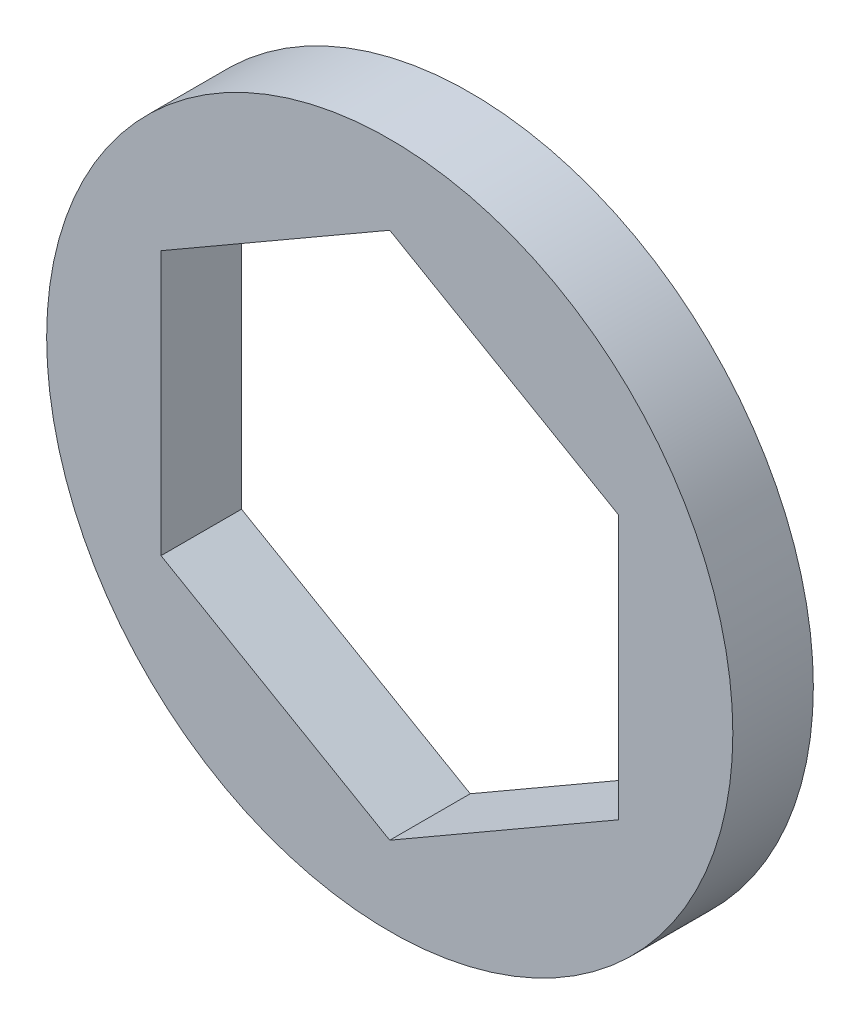
ISO-10303-21;
HEADER;
FILE_DESCRIPTION(('STEP AP214'),'2;1');
FILE_NAME('part.step','',(''),(''),'','','');
FILE_SCHEMA(('AUTOMOTIVE_DESIGN { 1 0 10303 214 1 1 1 1 }'));
ENDSEC;
DATA;
#1=APPLICATION_CONTEXT('core data for automotive mechanical design processes');
#2=APPLICATION_PROTOCOL_DEFINITION('international standard','automotive_design',2000,#1);
#3=PRODUCT_CONTEXT('',#1,'mechanical');
#4=PRODUCT('Part','Part','',(#3));
#5=PRODUCT_RELATED_PRODUCT_CATEGORY('part','',(#4));
#6=PRODUCT_DEFINITION_FORMATION('','',#4);
#7=PRODUCT_DEFINITION_CONTEXT('part definition',#1,'design');
#8=PRODUCT_DEFINITION('design','',#6,#7);
#9=PRODUCT_DEFINITION_SHAPE('','',#8);
#10=(LENGTH_UNIT() NAMED_UNIT(*) SI_UNIT(.MILLI.,.METRE.));
#11=(NAMED_UNIT(*) PLANE_ANGLE_UNIT() SI_UNIT($,.RADIAN.));
#12=(NAMED_UNIT(*) SI_UNIT($,.STERADIAN.) SOLID_ANGLE_UNIT());
#13=UNCERTAINTY_MEASURE_WITH_UNIT(LENGTH_MEASURE(1.E-05),#10,'distance_accuracy_value','');
#14=(GEOMETRIC_REPRESENTATION_CONTEXT(3) GLOBAL_UNCERTAINTY_ASSIGNED_CONTEXT((#13)) GLOBAL_UNIT_ASSIGNED_CONTEXT((#10,
#11,#12)) REPRESENTATION_CONTEXT('',''));
#15=CARTESIAN_POINT('',(0.,0.,0.));
#16=DIRECTION('',(0.,0.,1.));
#17=DIRECTION('',(1.,0.,0.));
#18=AXIS2_PLACEMENT_3D('',#15,#16,#17);
#19=CARTESIAN_POINT('',(0.,0.,2.2352));
#20=DIRECTION('',(0.,0.,1.));
#21=DIRECTION('',(1.,0.,0.));
#22=AXIS2_PLACEMENT_3D('',#19,#20,#21);
#23=PLANE('',#22);
#24=CARTESIAN_POINT('',(0.,0.,2.2352));
#25=DIRECTION('',(0.,0.,1.));
#26=DIRECTION('',(1.,0.,0.));
#27=AXIS2_PLACEMENT_3D('',#24,#25,#26);
#28=CIRCLE('',#27,9.525);
#29=CARTESIAN_POINT('',(9.525,0.,2.2352));
#30=VERTEX_POINT('',#29);
#31=EDGE_CURVE('E11',#30,#30,#28,.T.);
#32=ORIENTED_EDGE('',*,*,#31,.T.);
#33=EDGE_LOOP('',(#32));
#34=FACE_BOUND('',#33,.T.);
#35=DIRECTION('',(-0.866025403784439,-0.5,0.));
#36=VECTOR('',#35,1.);
#37=CARTESIAN_POINT('',(0.,7.33234841870825,2.2352));
#38=LINE('',#37,#36);
#39=CARTESIAN_POINT('',(0.,7.33234841870825,2.2352));
#40=VERTEX_POINT('',#39);
#41=CARTESIAN_POINT('',(-6.35,3.66617420935413,2.2352));
#42=VERTEX_POINT('',#41);
#43=EDGE_CURVE('E98',#40,#42,#38,.T.);
#44=ORIENTED_EDGE('',*,*,#43,.F.);
#45=DIRECTION('',(-0.866025403784439,0.5,0.));
#46=VECTOR('',#45,1.);
#47=CARTESIAN_POINT('',(6.35,3.66617420935412,2.2352));
#48=LINE('',#47,#46);
#49=CARTESIAN_POINT('',(6.35,3.66617420935412,2.2352));
#50=VERTEX_POINT('',#49);
#51=EDGE_CURVE('E90',#50,#40,#48,.T.);
#52=ORIENTED_EDGE('',*,*,#51,.F.);
#53=DIRECTION('',(0.,1.,0.));
#54=VECTOR('',#53,1.);
#55=CARTESIAN_POINT('',(6.35,-3.66617420935412,2.2352));
#56=LINE('',#55,#54);
#57=CARTESIAN_POINT('',(6.35,-3.66617420935412,2.2352));
#58=VERTEX_POINT('',#57);
#59=EDGE_CURVE('E118',#58,#50,#56,.T.);
#60=ORIENTED_EDGE('',*,*,#59,.F.);
#61=DIRECTION('',(0.866025403784439,0.5,0.));
#62=VECTOR('',#61,1.);
#63=CARTESIAN_POINT('',(0.,-7.33234841870825,2.2352));
#64=LINE('',#63,#62);
#65=CARTESIAN_POINT('',(0.,-7.33234841870825,2.2352));
#66=VERTEX_POINT('',#65);
#67=EDGE_CURVE('E116',#66,#58,#64,.T.);
#68=ORIENTED_EDGE('',*,*,#67,.F.);
#69=DIRECTION('',(0.866025403784439,-0.5,0.));
#70=VECTOR('',#69,1.);
#71=CARTESIAN_POINT('',(-6.35,-3.66617420935412,2.2352));
#72=LINE('',#71,#70);
#73=CARTESIAN_POINT('',(-6.35,-3.66617420935412,2.2352));
#74=VERTEX_POINT('',#73);
#75=EDGE_CURVE('E112',#74,#66,#72,.T.);
#76=ORIENTED_EDGE('',*,*,#75,.F.);
#77=DIRECTION('',(0.,-1.,0.));
#78=VECTOR('',#77,1.);
#79=CARTESIAN_POINT('',(-6.35,3.66617420935413,2.2352));
#80=LINE('',#79,#78);
#81=EDGE_CURVE('E110',#42,#74,#80,.T.);
#82=ORIENTED_EDGE('',*,*,#81,.F.);
#83=EDGE_LOOP('',(#44,#52,#60,#68,#76,#82));
#84=FACE_BOUND('',#83,.T.);
#85=ADVANCED_FACE('F37',(#34,#84),#23,.T.);
#86=CARTESIAN_POINT('',(0.,0.,0.));
#87=DIRECTION('',(0.,0.,1.));
#88=DIRECTION('',(1.,0.,0.));
#89=AXIS2_PLACEMENT_3D('',#86,#87,#88);
#90=PLANE('',#89);
#91=CARTESIAN_POINT('',(0.,0.,0.));
#92=DIRECTION('',(0.,0.,1.));
#93=DIRECTION('',(1.,0.,0.));
#94=AXIS2_PLACEMENT_3D('',#91,#92,#93);
#95=CIRCLE('',#94,9.525);
#96=CARTESIAN_POINT('',(9.525,0.,0.));
#97=VERTEX_POINT('',#96);
#98=EDGE_CURVE('E41',#97,#97,#95,.T.);
#99=ORIENTED_EDGE('',*,*,#98,.F.);
#100=EDGE_LOOP('',(#99));
#101=FACE_BOUND('',#100,.T.);
#102=DIRECTION('',(-0.866025403784439,0.5,0.));
#103=VECTOR('',#102,1.);
#104=CARTESIAN_POINT('',(6.35,3.66617420935412,0.));
#105=LINE('',#104,#103);
#106=CARTESIAN_POINT('',(6.35,3.66617420935412,0.));
#107=VERTEX_POINT('',#106);
#108=CARTESIAN_POINT('',(0.,7.33234841870825,0.));
#109=VERTEX_POINT('',#108);
#110=EDGE_CURVE('E60',#107,#109,#105,.T.);
#111=ORIENTED_EDGE('',*,*,#110,.T.);
#112=DIRECTION('',(-0.866025403784439,-0.5,0.));
#113=VECTOR('',#112,1.);
#114=CARTESIAN_POINT('',(0.,7.33234841870825,0.));
#115=LINE('',#114,#113);
#116=CARTESIAN_POINT('',(-6.35,3.66617420935413,0.));
#117=VERTEX_POINT('',#116);
#118=EDGE_CURVE('E105',#109,#117,#115,.T.);
#119=ORIENTED_EDGE('',*,*,#118,.T.);
#120=DIRECTION('',(0.,-1.,0.));
#121=VECTOR('',#120,1.);
#122=CARTESIAN_POINT('',(-6.35,3.66617420935413,0.));
#123=LINE('',#122,#121);
#124=CARTESIAN_POINT('',(-6.35,-3.66617420935412,0.));
#125=VERTEX_POINT('',#124);
#126=EDGE_CURVE('E122',#117,#125,#123,.T.);
#127=ORIENTED_EDGE('',*,*,#126,.T.);
#128=DIRECTION('',(0.866025403784439,-0.5,0.));
#129=VECTOR('',#128,1.);
#130=CARTESIAN_POINT('',(-6.35,-3.66617420935412,0.));
#131=LINE('',#130,#129);
#132=CARTESIAN_POINT('',(0.,-7.33234841870825,0.));
#133=VERTEX_POINT('',#132);
#134=EDGE_CURVE('E125',#125,#133,#131,.T.);
#135=ORIENTED_EDGE('',*,*,#134,.T.);
#136=DIRECTION('',(0.866025403784439,0.5,0.));
#137=VECTOR('',#136,1.);
#138=CARTESIAN_POINT('',(0.,-7.33234841870825,0.));
#139=LINE('',#138,#137);
#140=CARTESIAN_POINT('',(6.35,-3.66617420935412,0.));
#141=VERTEX_POINT('',#140);
#142=EDGE_CURVE('E128',#133,#141,#139,.T.);
#143=ORIENTED_EDGE('',*,*,#142,.T.);
#144=DIRECTION('',(0.,1.,0.));
#145=VECTOR('',#144,1.);
#146=CARTESIAN_POINT('',(6.35,-3.66617420935412,0.));
#147=LINE('',#146,#145);
#148=EDGE_CURVE('E99',#141,#107,#147,.T.);
#149=ORIENTED_EDGE('',*,*,#148,.T.);
#150=EDGE_LOOP('',(#111,#119,#127,#135,#143,#149));
#151=FACE_BOUND('',#150,.T.);
#152=ADVANCED_FACE('F145',(#101,#151),#90,.F.);
#153=CARTESIAN_POINT('',(0.,0.,2.2352));
#154=DIRECTION('',(0.,0.,-1.));
#155=DIRECTION('',(-1.,0.,0.));
#156=AXIS2_PLACEMENT_3D('',#153,#154,#155);
#157=CYLINDRICAL_SURFACE('',#156,9.525);
#158=ORIENTED_EDGE('',*,*,#31,.F.);
#159=EDGE_LOOP('',(#158));
#160=FACE_BOUND('',#159,.T.);
#161=ORIENTED_EDGE('',*,*,#98,.T.);
#162=EDGE_LOOP('',(#161));
#163=FACE_BOUND('',#162,.T.);
#164=ADVANCED_FACE('F39',(#160,#163),#157,.T.);
#165=CARTESIAN_POINT('',(6.35,3.66617420935412,2.2352));
#166=DIRECTION('',(-0.5,-0.866025403784439,0.));
#167=DIRECTION('',(0.866025403784439,-0.5,0.));
#168=AXIS2_PLACEMENT_3D('',#165,#166,#167);
#169=PLANE('',#168);
#170=ORIENTED_EDGE('',*,*,#110,.F.);
#171=DIRECTION('',(0.,0.,-1.));
#172=VECTOR('',#171,1.);
#173=CARTESIAN_POINT('',(6.35,3.66617420935412,2.2352));
#174=LINE('',#173,#172);
#175=EDGE_CURVE('E94',#50,#107,#174,.T.);
#176=ORIENTED_EDGE('',*,*,#175,.F.);
#177=ORIENTED_EDGE('',*,*,#51,.T.);
#178=DIRECTION('',(0.,0.,-1.));
#179=VECTOR('',#178,1.);
#180=CARTESIAN_POINT('',(0.,7.33234841870825,2.2352));
#181=LINE('',#180,#179);
#182=EDGE_CURVE('E93',#40,#109,#181,.T.);
#183=ORIENTED_EDGE('',*,*,#182,.T.);
#184=EDGE_LOOP('',(#170,#176,#177,#183));
#185=FACE_BOUND('',#184,.T.);
#186=ADVANCED_FACE('F92',(#185),#169,.T.);
#187=CARTESIAN_POINT('',(0.,7.33234841870825,2.2352));
#188=DIRECTION('',(0.5,-0.866025403784439,0.));
#189=DIRECTION('',(0.866025403784439,0.5,0.));
#190=AXIS2_PLACEMENT_3D('',#187,#188,#189);
#191=PLANE('',#190);
#192=ORIENTED_EDGE('',*,*,#118,.F.);
#193=ORIENTED_EDGE('',*,*,#182,.F.);
#194=ORIENTED_EDGE('',*,*,#43,.T.);
#195=DIRECTION('',(0.,0.,-1.));
#196=VECTOR('',#195,1.);
#197=CARTESIAN_POINT('',(-6.35,3.66617420935413,2.2352));
#198=LINE('',#197,#196);
#199=EDGE_CURVE('E106',#42,#117,#198,.T.);
#200=ORIENTED_EDGE('',*,*,#199,.T.);
#201=EDGE_LOOP('',(#192,#193,#194,#200));
#202=FACE_BOUND('',#201,.T.);
#203=ADVANCED_FACE('F102',(#202),#191,.T.);
#204=CARTESIAN_POINT('',(-6.35,3.66617420935413,2.2352));
#205=DIRECTION('',(1.,0.,0.));
#206=DIRECTION('',(0.,1.,0.));
#207=AXIS2_PLACEMENT_3D('',#204,#205,#206);
#208=PLANE('',#207);
#209=ORIENTED_EDGE('',*,*,#126,.F.);
#210=ORIENTED_EDGE('',*,*,#199,.F.);
#211=ORIENTED_EDGE('',*,*,#81,.T.);
#212=DIRECTION('',(0.,0.,-1.));
#213=VECTOR('',#212,1.);
#214=CARTESIAN_POINT('',(-6.35,-3.66617420935412,2.2352));
#215=LINE('',#214,#213);
#216=EDGE_CURVE('E137',#74,#125,#215,.T.);
#217=ORIENTED_EDGE('',*,*,#216,.T.);
#218=EDGE_LOOP('',(#209,#210,#211,#217));
#219=FACE_BOUND('',#218,.T.);
#220=ADVANCED_FACE('F141',(#219),#208,.T.);
#221=CARTESIAN_POINT('',(-6.35,-3.66617420935412,2.2352));
#222=DIRECTION('',(0.5,0.866025403784439,0.));
#223=DIRECTION('',(-0.866025403784439,0.5,0.));
#224=AXIS2_PLACEMENT_3D('',#221,#222,#223);
#225=PLANE('',#224);
#226=ORIENTED_EDGE('',*,*,#134,.F.);
#227=ORIENTED_EDGE('',*,*,#216,.F.);
#228=ORIENTED_EDGE('',*,*,#75,.T.);
#229=DIRECTION('',(0.,0.,-1.));
#230=VECTOR('',#229,1.);
#231=CARTESIAN_POINT('',(0.,-7.33234841870825,2.2352));
#232=LINE('',#231,#230);
#233=EDGE_CURVE('E135',#66,#133,#232,.T.);
#234=ORIENTED_EDGE('',*,*,#233,.T.);
#235=EDGE_LOOP('',(#226,#227,#228,#234));
#236=FACE_BOUND('',#235,.T.);
#237=ADVANCED_FACE('F153',(#236),#225,.T.);
#238=CARTESIAN_POINT('',(0.,-7.33234841870825,2.2352));
#239=DIRECTION('',(-0.5,0.866025403784439,0.));
#240=DIRECTION('',(-0.866025403784439,-0.5,0.));
#241=AXIS2_PLACEMENT_3D('',#238,#239,#240);
#242=PLANE('',#241);
#243=ORIENTED_EDGE('',*,*,#142,.F.);
#244=ORIENTED_EDGE('',*,*,#233,.F.);
#245=ORIENTED_EDGE('',*,*,#67,.T.);
#246=DIRECTION('',(0.,0.,-1.));
#247=VECTOR('',#246,1.);
#248=CARTESIAN_POINT('',(6.35,-3.66617420935412,2.2352));
#249=LINE('',#248,#247);
#250=EDGE_CURVE('E52',#58,#141,#249,.T.);
#251=ORIENTED_EDGE('',*,*,#250,.T.);
#252=EDGE_LOOP('',(#243,#244,#245,#251));
#253=FACE_BOUND('',#252,.T.);
#254=ADVANCED_FACE('F151',(#253),#242,.T.);
#255=CARTESIAN_POINT('',(6.35,-3.66617420935412,2.2352));
#256=DIRECTION('',(-1.,0.,0.));
#257=DIRECTION('',(0.,-1.,0.));
#258=AXIS2_PLACEMENT_3D('',#255,#256,#257);
#259=PLANE('',#258);
#260=ORIENTED_EDGE('',*,*,#148,.F.);
#261=ORIENTED_EDGE('',*,*,#250,.F.);
#262=ORIENTED_EDGE('',*,*,#59,.T.);
#263=ORIENTED_EDGE('',*,*,#175,.T.);
#264=EDGE_LOOP('',(#260,#261,#262,#263));
#265=FACE_BOUND('',#264,.T.);
#266=ADVANCED_FACE('F147',(#265),#259,.T.);
#267=CLOSED_SHELL('',(#85,#152,#164,#186,#203,#220,#237,#254,#266));
#268=MANIFOLD_SOLID_BREP('B2',#267);
#269=ADVANCED_BREP_SHAPE_REPRESENTATION('',(#18,#268),#14);
#270=SHAPE_DEFINITION_REPRESENTATION(#9,#269);
ENDSEC;
END-ISO-10303-21;
